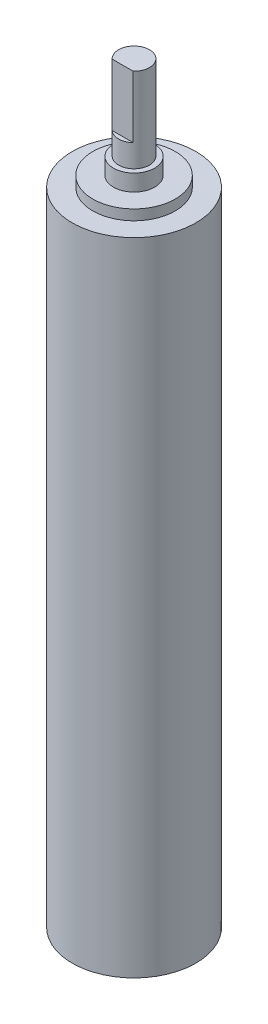
ISO-10303-21;
HEADER;
FILE_DESCRIPTION(('STEP AP214'),'2;1');
FILE_NAME('part.step','',(''),(''),'','','');
FILE_SCHEMA(('AUTOMOTIVE_DESIGN { 1 0 10303 214 1 1 1 1 }'));
ENDSEC;
DATA;
#1=APPLICATION_CONTEXT('core data for automotive mechanical design processes');
#2=APPLICATION_PROTOCOL_DEFINITION('international standard','automotive_design',2000,#1);
#3=PRODUCT_CONTEXT('',#1,'mechanical');
#4=PRODUCT('Part','Part','',(#3));
#5=PRODUCT_RELATED_PRODUCT_CATEGORY('part','',(#4));
#6=PRODUCT_DEFINITION_FORMATION('','',#4);
#7=PRODUCT_DEFINITION_CONTEXT('part definition',#1,'design');
#8=PRODUCT_DEFINITION('design','',#6,#7);
#9=PRODUCT_DEFINITION_SHAPE('','',#8);
#10=(LENGTH_UNIT() NAMED_UNIT(*) SI_UNIT(.MILLI.,.METRE.));
#11=(NAMED_UNIT(*) PLANE_ANGLE_UNIT() SI_UNIT($,.RADIAN.));
#12=(NAMED_UNIT(*) SI_UNIT($,.STERADIAN.) SOLID_ANGLE_UNIT());
#13=UNCERTAINTY_MEASURE_WITH_UNIT(LENGTH_MEASURE(1.E-05),#10,'distance_accuracy_value','');
#14=(GEOMETRIC_REPRESENTATION_CONTEXT(3) GLOBAL_UNCERTAINTY_ASSIGNED_CONTEXT((#13)) GLOBAL_UNIT_ASSIGNED_CONTEXT((#10,
#11,#12)) REPRESENTATION_CONTEXT('',''));
#15=CARTESIAN_POINT('',(0.,0.,0.));
#16=DIRECTION('',(0.,0.,1.));
#17=DIRECTION('',(1.,0.,0.));
#18=AXIS2_PLACEMENT_3D('',#15,#16,#17);
#19=CARTESIAN_POINT('',(0.,32.3,0.));
#20=DIRECTION('',(0.,-1.,0.));
#21=DIRECTION('',(0.,0.,-1.));
#22=AXIS2_PLACEMENT_3D('',#19,#20,#21);
#23=CYLINDRICAL_SURFACE('',#22,0.75);
#24=CARTESIAN_POINT('',(0.,28.2,0.));
#25=DIRECTION('',(0.,1.,0.));
#26=DIRECTION('',(0.,0.,1.));
#27=AXIS2_PLACEMENT_3D('',#24,#25,#26);
#28=CIRCLE('',#27,0.75);
#29=CARTESIAN_POINT('',(0.,28.2,0.75));
#30=VERTEX_POINT('',#29);
#31=EDGE_CURVE('E71',#30,#30,#28,.T.);
#32=ORIENTED_EDGE('',*,*,#31,.T.);
#33=EDGE_LOOP('',(#32));
#34=FACE_BOUND('',#33,.T.);
#35=CARTESIAN_POINT('',(0.,29.3,0.));
#36=DIRECTION('',(0.,1.,0.));
#37=DIRECTION('',(0.,0.,1.));
#38=AXIS2_PLACEMENT_3D('',#35,#36,#37);
#39=CIRCLE('',#38,0.75);
#40=CARTESIAN_POINT('',(-0.509901951359279,29.3,0.55));
#41=VERTEX_POINT('',#40);
#42=CARTESIAN_POINT('',(0.509901951359279,29.3,0.55));
#43=VERTEX_POINT('',#42);
#44=EDGE_CURVE('E12',#41,#43,#39,.T.);
#45=ORIENTED_EDGE('',*,*,#44,.F.);
#46=DIRECTION('',(0.,1.,0.));
#47=VECTOR('',#46,1.);
#48=CARTESIAN_POINT('',(-0.509901951359279,29.3,0.55));
#49=LINE('',#48,#47);
#50=CARTESIAN_POINT('',(-0.509901951359279,32.3,0.55));
#51=VERTEX_POINT('',#50);
#52=EDGE_CURVE('E60',#41,#51,#49,.T.);
#53=ORIENTED_EDGE('',*,*,#52,.T.);
#54=CARTESIAN_POINT('',(0.,32.3,0.));
#55=DIRECTION('',(0.,1.,0.));
#56=DIRECTION('',(0.,0.,1.));
#57=AXIS2_PLACEMENT_3D('',#54,#55,#56);
#58=CIRCLE('',#57,0.75);
#59=CARTESIAN_POINT('',(0.509901951359279,32.3,0.55));
#60=VERTEX_POINT('',#59);
#61=EDGE_CURVE('E70',#60,#51,#58,.T.);
#62=ORIENTED_EDGE('',*,*,#61,.F.);
#63=DIRECTION('',(0.,1.,0.));
#64=VECTOR('',#63,1.);
#65=CARTESIAN_POINT('',(0.509901951359279,29.3,0.55));
#66=LINE('',#65,#64);
#67=EDGE_CURVE('E49',#43,#60,#66,.T.);
#68=ORIENTED_EDGE('',*,*,#67,.F.);
#69=EDGE_LOOP('',(#45,#53,#62,#68));
#70=FACE_BOUND('',#69,.T.);
#71=ADVANCED_FACE('F34',(#34,#70),#23,.T.);
#72=CARTESIAN_POINT('',(0.,32.3,0.));
#73=DIRECTION('',(0.,1.,0.));
#74=DIRECTION('',(0.,0.,1.));
#75=AXIS2_PLACEMENT_3D('',#72,#73,#74);
#76=PLANE('',#75);
#77=ORIENTED_EDGE('',*,*,#61,.T.);
#78=DIRECTION('',(1.,0.,0.));
#79=VECTOR('',#78,1.);
#80=CARTESIAN_POINT('',(-0.509901951359279,32.3,0.55));
#81=LINE('',#80,#79);
#82=EDGE_CURVE('E63',#51,#60,#81,.T.);
#83=ORIENTED_EDGE('',*,*,#82,.T.);
#84=EDGE_LOOP('',(#77,#83));
#85=FACE_BOUND('',#84,.T.);
#86=ADVANCED_FACE('F99',(#85),#76,.T.);
#87=CARTESIAN_POINT('',(0.,26.9,0.));
#88=DIRECTION('',(0.,-1.,0.));
#89=DIRECTION('',(0.,0.,-1.));
#90=AXIS2_PLACEMENT_3D('',#87,#88,#89);
#91=CYLINDRICAL_SURFACE('',#90,3.);
#92=CARTESIAN_POINT('',(0.,26.9,0.));
#93=DIRECTION('',(0.,1.,0.));
#94=DIRECTION('',(0.,0.,1.));
#95=AXIS2_PLACEMENT_3D('',#92,#93,#94);
#96=CIRCLE('',#95,3.);
#97=CARTESIAN_POINT('',(0.,26.9,-3.));
#98=VERTEX_POINT('',#97);
#99=EDGE_CURVE('E42',#98,#98,#96,.T.);
#100=CARTESIAN_POINT('',(0.,-4.2,0.));
#101=DIRECTION('',(0.,-1.,0.));
#102=DIRECTION('',(0.,0.,-1.));
#103=AXIS2_PLACEMENT_3D('',#100,#101,#102);
#104=CIRCLE('',#103,3.);
#105=CARTESIAN_POINT('',(0.,-4.2,-3.));
#106=VERTEX_POINT('',#105);
#107=EDGE_CURVE('E88',#106,#106,#104,.T.);
#108=CARTESIAN_POINT('',(0.,26.9,-3.));
#109=CARTESIAN_POINT('',(0.,26.5760416666667,-3.));
#110=CARTESIAN_POINT('',(0.,26.2520833333333,-3.));
#111=CARTESIAN_POINT('',(0.,25.6041666666667,-3.));
#112=CARTESIAN_POINT('',(0.,25.2802083333333,-3.));
#113=CARTESIAN_POINT('',(0.,24.6322916666667,-3.));
#114=CARTESIAN_POINT('',(0.,24.3083333333333,-3.));
#115=CARTESIAN_POINT('',(0.,23.6604166666667,-3.));
#116=CARTESIAN_POINT('',(0.,23.3364583333333,-3.));
#117=CARTESIAN_POINT('',(0.,22.6885416666667,-3.));
#118=CARTESIAN_POINT('',(0.,22.3645833333333,-3.));
#119=CARTESIAN_POINT('',(0.,21.7166666666667,-3.));
#120=CARTESIAN_POINT('',(0.,21.3927083333333,-3.));
#121=CARTESIAN_POINT('',(0.,20.7447916666667,-3.));
#122=CARTESIAN_POINT('',(0.,20.4208333333333,-3.));
#123=CARTESIAN_POINT('',(0.,19.7729166666667,-3.));
#124=CARTESIAN_POINT('',(0.,19.4489583333333,-3.));
#125=CARTESIAN_POINT('',(0.,18.8010416666667,-3.));
#126=CARTESIAN_POINT('',(0.,18.4770833333333,-3.));
#127=CARTESIAN_POINT('',(0.,17.8291666666667,-3.));
#128=CARTESIAN_POINT('',(0.,17.5052083333333,-3.));
#129=CARTESIAN_POINT('',(0.,16.8572916666667,-3.));
#130=CARTESIAN_POINT('',(0.,16.5333333333333,-3.));
#131=CARTESIAN_POINT('',(0.,15.8854166666667,-3.));
#132=CARTESIAN_POINT('',(0.,15.5614583333333,-3.));
#133=CARTESIAN_POINT('',(0.,14.9135416666667,-3.));
#134=CARTESIAN_POINT('',(0.,14.5895833333333,-3.));
#135=CARTESIAN_POINT('',(0.,13.9416666666667,-3.));
#136=CARTESIAN_POINT('',(0.,13.6177083333333,-3.));
#137=CARTESIAN_POINT('',(0.,12.9697916666667,-3.));
#138=CARTESIAN_POINT('',(0.,12.6458333333333,-3.));
#139=CARTESIAN_POINT('',(0.,11.9979166666667,-3.));
#140=CARTESIAN_POINT('',(0.,11.6739583333333,-3.));
#141=CARTESIAN_POINT('',(0.,11.0260416666667,-3.));
#142=CARTESIAN_POINT('',(0.,10.7020833333333,-3.));
#143=CARTESIAN_POINT('',(0.,10.0541666666667,-3.));
#144=CARTESIAN_POINT('',(0.,9.73020833333334,-3.));
#145=CARTESIAN_POINT('',(0.,9.08229166666667,-3.));
#146=CARTESIAN_POINT('',(0.,8.75833333333333,-3.));
#147=CARTESIAN_POINT('',(0.,8.11041666666667,-3.));
#148=CARTESIAN_POINT('',(0.,7.78645833333333,-3.));
#149=CARTESIAN_POINT('',(0.,7.13854166666667,-3.));
#150=CARTESIAN_POINT('',(0.,6.81458333333333,-3.));
#151=CARTESIAN_POINT('',(0.,6.16666666666667,-3.));
#152=CARTESIAN_POINT('',(0.,5.84270833333333,-3.));
#153=CARTESIAN_POINT('',(0.,5.19479166666667,-3.));
#154=CARTESIAN_POINT('',(0.,4.87083333333333,-3.));
#155=CARTESIAN_POINT('',(0.,4.22291666666667,-3.));
#156=CARTESIAN_POINT('',(0.,3.89895833333334,-3.));
#157=CARTESIAN_POINT('',(0.,3.25104166666667,-3.));
#158=CARTESIAN_POINT('',(0.,2.92708333333333,-3.));
#159=CARTESIAN_POINT('',(0.,2.27916666666667,-3.));
#160=CARTESIAN_POINT('',(0.,1.95520833333333,-3.));
#161=CARTESIAN_POINT('',(0.,1.30729166666667,-3.));
#162=CARTESIAN_POINT('',(0.,0.983333333333334,-3.));
#163=CARTESIAN_POINT('',(0.,0.335416666666667,-3.));
#164=CARTESIAN_POINT('',(0.,0.0114583333333332,-3.));
#165=CARTESIAN_POINT('',(0.,-0.636458333333333,-3.));
#166=CARTESIAN_POINT('',(0.,-0.960416666666665,-3.));
#167=CARTESIAN_POINT('',(0.,-1.60833333333333,-3.));
#168=CARTESIAN_POINT('',(0.,-1.93229166666666,-3.));
#169=CARTESIAN_POINT('',(0.,-2.58020833333333,-3.));
#170=CARTESIAN_POINT('',(0.,-2.90416666666667,-3.));
#171=CARTESIAN_POINT('',(0.,-3.55208333333333,-3.));
#172=CARTESIAN_POINT('',(0.,-3.87604166666667,-3.));
#173=CARTESIAN_POINT('',(0.,-4.2,-3.));
#174=B_SPLINE_CURVE_WITH_KNOTS('',3,(#108,#109,#110,#111,#112,#113,#114,#115,#116,#117,#118,
#119,#120,#121,#122,#123,#124,#125,#126,#127,#128,#129,#130,#131,#132,#133,#134,#135,#136,#137,
#138,#139,#140,#141,#142,#143,#144,#145,#146,#147,#148,#149,#150,#151,#152,#153,#154,#155,#156,
#157,#158,#159,#160,#161,#162,#163,#164,#165,#166,#167,#168,#169,#170,#171,#172,#173),
.UNSPECIFIED.,.F.,.F.,(4,2,2,2,2,2,2,2,2,2,2,2,2,2,2,2,2,2,2,2,2,2,2,2,2,2,2,2,2,2,2,2,4),(0.,
0.971874999999997,1.94375,2.915625,3.8875,4.859375,5.83125,6.803125,7.775,8.746875,
9.71874999999999,10.690625,11.6625,12.634375,13.60625,14.578125,15.55,16.521875,17.49375,
18.465625,19.4375,20.409375,21.38125,22.353125,23.325,24.296875,25.26875,26.240625,27.2125,
28.184375,29.15625,30.128125,31.1),.UNSPECIFIED.);
#175=EDGE_CURVE('BSEAM36',#98,#106,#174,.T.);
#176=ORIENTED_EDGE('',*,*,#99,.F.);
#177=ORIENTED_EDGE('',*,*,#107,.F.);
#178=ORIENTED_EDGE('',*,*,#175,.T.);
#179=ORIENTED_EDGE('',*,*,#175,.F.);
#180=EDGE_LOOP('',(#176,#178,#177,#179));
#181=FACE_BOUND('',#180,.T.);
#182=ADVANCED_FACE('F36',(#181),#91,.T.);
#183=CARTESIAN_POINT('',(0.,26.9,0.));
#184=DIRECTION('',(0.,1.,0.));
#185=DIRECTION('',(0.,0.,1.));
#186=AXIS2_PLACEMENT_3D('',#183,#184,#185);
#187=PLANE('',#186);
#188=CARTESIAN_POINT('',(0.,26.9,0.));
#189=DIRECTION('',(0.,1.,0.));
#190=DIRECTION('',(0.,0.,1.));
#191=AXIS2_PLACEMENT_3D('',#188,#189,#190);
#192=CIRCLE('',#191,2.);
#193=CARTESIAN_POINT('',(0.,26.9,2.));
#194=VERTEX_POINT('',#193);
#195=EDGE_CURVE('E82',#194,#194,#192,.T.);
#196=ORIENTED_EDGE('',*,*,#195,.F.);
#197=EDGE_LOOP('',(#196));
#198=FACE_BOUND('',#197,.T.);
#199=ORIENTED_EDGE('',*,*,#99,.T.);
#200=EDGE_LOOP('',(#199));
#201=FACE_BOUND('',#200,.T.);
#202=ADVANCED_FACE('F95',(#198,#201),#187,.T.);
#203=CARTESIAN_POINT('',(0.,-4.2,0.));
#204=DIRECTION('',(0.,-1.,0.));
#205=DIRECTION('',(0.,0.,-1.));
#206=AXIS2_PLACEMENT_3D('',#203,#204,#205);
#207=PLANE('',#206);
#208=ORIENTED_EDGE('',*,*,#107,.T.);
#209=EDGE_LOOP('',(#208));
#210=FACE_BOUND('',#209,.T.);
#211=ADVANCED_FACE('F102',(#210),#207,.T.);
#212=CARTESIAN_POINT('',(0.,27.4,0.));
#213=DIRECTION('',(0.,-1.,0.));
#214=DIRECTION('',(0.,0.,-1.));
#215=AXIS2_PLACEMENT_3D('',#212,#213,#214);
#216=CYLINDRICAL_SURFACE('',#215,2.);
#217=CARTESIAN_POINT('',(0.,27.4,0.));
#218=DIRECTION('',(0.,1.,0.));
#219=DIRECTION('',(0.,0.,1.));
#220=AXIS2_PLACEMENT_3D('',#217,#218,#219);
#221=CIRCLE('',#220,2.);
#222=CARTESIAN_POINT('',(0.,27.4,2.));
#223=VERTEX_POINT('',#222);
#224=EDGE_CURVE('E85',#223,#223,#221,.T.);
#225=ORIENTED_EDGE('',*,*,#224,.F.);
#226=EDGE_LOOP('',(#225));
#227=FACE_BOUND('',#226,.T.);
#228=ORIENTED_EDGE('',*,*,#195,.T.);
#229=EDGE_LOOP('',(#228));
#230=FACE_BOUND('',#229,.T.);
#231=ADVANCED_FACE('F104',(#227,#230),#216,.T.);
#232=CARTESIAN_POINT('',(0.,27.4,0.));
#233=DIRECTION('',(0.,1.,0.));
#234=DIRECTION('',(0.,0.,1.));
#235=AXIS2_PLACEMENT_3D('',#232,#233,#234);
#236=PLANE('',#235);
#237=CARTESIAN_POINT('',(0.,27.4,0.));
#238=DIRECTION('',(0.,1.,0.));
#239=DIRECTION('',(0.,0.,1.));
#240=AXIS2_PLACEMENT_3D('',#237,#238,#239);
#241=CIRCLE('',#240,1.);
#242=CARTESIAN_POINT('',(0.,27.4,1.));
#243=VERTEX_POINT('',#242);
#244=EDGE_CURVE('E77',#243,#243,#241,.T.);
#245=ORIENTED_EDGE('',*,*,#244,.F.);
#246=EDGE_LOOP('',(#245));
#247=FACE_BOUND('',#246,.T.);
#248=ORIENTED_EDGE('',*,*,#224,.T.);
#249=EDGE_LOOP('',(#248));
#250=FACE_BOUND('',#249,.T.);
#251=ADVANCED_FACE('F110',(#247,#250),#236,.T.);
#252=CARTESIAN_POINT('',(0.,28.2,0.));
#253=DIRECTION('',(0.,-1.,0.));
#254=DIRECTION('',(0.,0.,-1.));
#255=AXIS2_PLACEMENT_3D('',#252,#253,#254);
#256=CYLINDRICAL_SURFACE('',#255,1.);
#257=CARTESIAN_POINT('',(0.,28.2,0.));
#258=DIRECTION('',(0.,1.,0.));
#259=DIRECTION('',(0.,0.,1.));
#260=AXIS2_PLACEMENT_3D('',#257,#258,#259);
#261=CIRCLE('',#260,1.);
#262=CARTESIAN_POINT('',(0.,28.2,1.));
#263=VERTEX_POINT('',#262);
#264=EDGE_CURVE('E79',#263,#263,#261,.T.);
#265=ORIENTED_EDGE('',*,*,#264,.F.);
#266=EDGE_LOOP('',(#265));
#267=FACE_BOUND('',#266,.T.);
#268=ORIENTED_EDGE('',*,*,#244,.T.);
#269=EDGE_LOOP('',(#268));
#270=FACE_BOUND('',#269,.T.);
#271=ADVANCED_FACE('F127',(#267,#270),#256,.T.);
#272=CARTESIAN_POINT('',(0.,28.2,0.));
#273=DIRECTION('',(0.,1.,0.));
#274=DIRECTION('',(0.,0.,1.));
#275=AXIS2_PLACEMENT_3D('',#272,#273,#274);
#276=PLANE('',#275);
#277=ORIENTED_EDGE('',*,*,#31,.F.);
#278=EDGE_LOOP('',(#277));
#279=FACE_BOUND('',#278,.T.);
#280=ORIENTED_EDGE('',*,*,#264,.T.);
#281=EDGE_LOOP('',(#280));
#282=FACE_BOUND('',#281,.T.);
#283=ADVANCED_FACE('F124',(#279,#282),#276,.T.);
#284=CARTESIAN_POINT('',(0.,29.3,0.));
#285=DIRECTION('',(0.,1.,0.));
#286=DIRECTION('',(0.,0.,1.));
#287=AXIS2_PLACEMENT_3D('',#284,#285,#286);
#288=PLANE('',#287);
#289=ORIENTED_EDGE('',*,*,#44,.T.);
#290=DIRECTION('',(1.,0.,0.));
#291=VECTOR('',#290,1.);
#292=CARTESIAN_POINT('',(-0.509901951359279,29.3,0.55));
#293=LINE('',#292,#291);
#294=EDGE_CURVE('E62',#41,#43,#293,.T.);
#295=ORIENTED_EDGE('',*,*,#294,.F.);
#296=EDGE_LOOP('',(#289,#295));
#297=FACE_BOUND('',#296,.T.);
#298=ADVANCED_FACE('F68',(#297),#288,.T.);
#299=CARTESIAN_POINT('',(-0.509901951359279,29.3,0.55));
#300=DIRECTION('',(0.,0.,1.));
#301=DIRECTION('',(1.,0.,0.));
#302=AXIS2_PLACEMENT_3D('',#299,#300,#301);
#303=PLANE('',#302);
#304=ORIENTED_EDGE('',*,*,#82,.F.);
#305=ORIENTED_EDGE('',*,*,#52,.F.);
#306=ORIENTED_EDGE('',*,*,#294,.T.);
#307=ORIENTED_EDGE('',*,*,#67,.T.);
#308=EDGE_LOOP('',(#304,#305,#306,#307));
#309=FACE_BOUND('',#308,.T.);
#310=ADVANCED_FACE('F61',(#309),#303,.T.);
#311=CLOSED_SHELL('',(#71,#86,#182,#202,#211,#231,#251,#271,#283,#298,#310));
#312=MANIFOLD_SOLID_BREP('B2',#311);
#313=ADVANCED_BREP_SHAPE_REPRESENTATION('',(#18,#312),#14);
#314=SHAPE_DEFINITION_REPRESENTATION(#9,#313);
ENDSEC;
END-ISO-10303-21;
